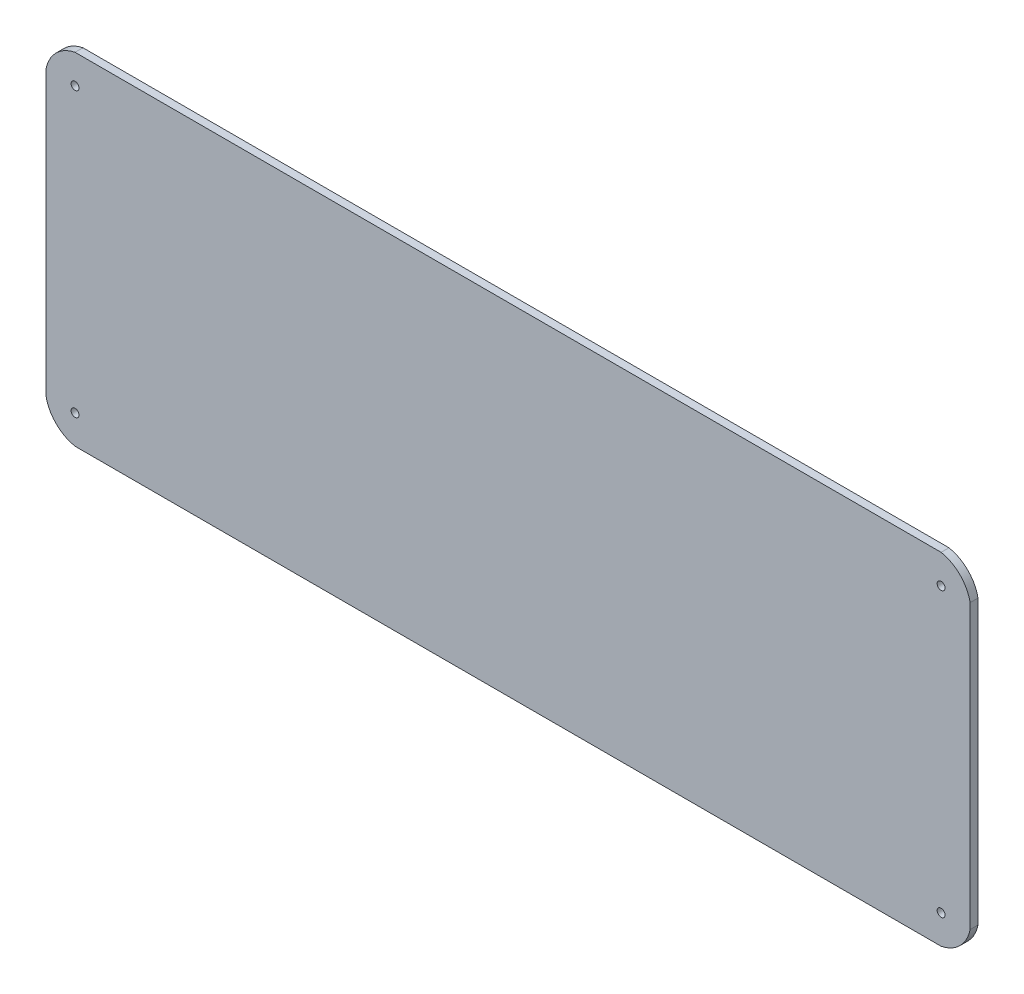
ISO-10303-21;
HEADER;
FILE_DESCRIPTION(('STEP AP214'),'2;1');
FILE_NAME('part.step','',(''),(''),'','','');
FILE_SCHEMA(('AUTOMOTIVE_DESIGN { 1 0 10303 214 1 1 1 1 }'));
ENDSEC;
DATA;
#1=APPLICATION_CONTEXT('core data for automotive mechanical design processes');
#2=APPLICATION_PROTOCOL_DEFINITION('international standard','automotive_design',2000,#1);
#3=PRODUCT_CONTEXT('',#1,'mechanical');
#4=PRODUCT('Part','Part','',(#3));
#5=PRODUCT_RELATED_PRODUCT_CATEGORY('part','',(#4));
#6=PRODUCT_DEFINITION_FORMATION('','',#4);
#7=PRODUCT_DEFINITION_CONTEXT('part definition',#1,'design');
#8=PRODUCT_DEFINITION('design','',#6,#7);
#9=PRODUCT_DEFINITION_SHAPE('','',#8);
#10=(LENGTH_UNIT() NAMED_UNIT(*) SI_UNIT(.MILLI.,.METRE.));
#11=(NAMED_UNIT(*) PLANE_ANGLE_UNIT() SI_UNIT($,.RADIAN.));
#12=(NAMED_UNIT(*) SI_UNIT($,.STERADIAN.) SOLID_ANGLE_UNIT());
#13=UNCERTAINTY_MEASURE_WITH_UNIT(LENGTH_MEASURE(1.E-05),#10,'distance_accuracy_value','');
#14=(GEOMETRIC_REPRESENTATION_CONTEXT(3) GLOBAL_UNCERTAINTY_ASSIGNED_CONTEXT((#13)) GLOBAL_UNIT_ASSIGNED_CONTEXT((#10,
#11,#12)) REPRESENTATION_CONTEXT('',''));
#15=CARTESIAN_POINT('',(0.,0.,0.));
#16=DIRECTION('',(0.,0.,1.));
#17=DIRECTION('',(1.,0.,0.));
#18=AXIS2_PLACEMENT_3D('',#15,#16,#17);
#19=CARTESIAN_POINT('',(-161.889002137033,51.0719371566333,3.));
#20=DIRECTION('',(0.,0.,1.));
#21=DIRECTION('',(1.,0.,0.));
#22=AXIS2_PLACEMENT_3D('',#19,#20,#21);
#23=PLANE('',#22);
#24=CARTESIAN_POINT('',(165.4303969933,-54.1267148028,3.));
#25=DIRECTION('',(0.,0.,1.));
#26=DIRECTION('',(1.,0.,0.));
#27=AXIS2_PLACEMENT_3D('',#24,#25,#26);
#28=CIRCLE('',#27,1.5);
#29=CARTESIAN_POINT('',(166.9303969933,-54.1267148028,3.));
#30=VERTEX_POINT('',#29);
#31=EDGE_CURVE('E188',#30,#30,#28,.T.);
#32=ORIENTED_EDGE('',*,*,#31,.F.);
#33=EDGE_LOOP('',(#32));
#34=FACE_BOUND('',#33,.T.);
#35=CARTESIAN_POINT('',(-164.5696030067,53.7525380263,3.));
#36=DIRECTION('',(0.,0.,1.));
#37=DIRECTION('',(1.,0.,0.));
#38=AXIS2_PLACEMENT_3D('',#35,#36,#37);
#39=CIRCLE('',#38,1.5);
#40=CARTESIAN_POINT('',(-163.0696030067,53.7525380263,3.));
#41=VERTEX_POINT('',#40);
#42=EDGE_CURVE('E134',#41,#41,#39,.T.);
#43=ORIENTED_EDGE('',*,*,#42,.F.);
#44=EDGE_LOOP('',(#43));
#45=FACE_BOUND('',#44,.T.);
#46=CARTESIAN_POINT('',(-161.889002137033,51.0719371566333,3.));
#47=DIRECTION('',(0.,0.,1.));
#48=DIRECTION('',(1.,0.,0.));
#49=AXIS2_PLACEMENT_3D('',#46,#47,#48);
#50=CIRCLE('',#49,14.);
#51=CARTESIAN_POINT('',(-164.5696030067,64.8129116118,3.));
#52=VERTEX_POINT('',#51);
#53=CARTESIAN_POINT('',(-175.6299765922,53.7525380263,3.));
#54=VERTEX_POINT('',#53);
#55=EDGE_CURVE('E145',#52,#54,#50,.T.);
#56=ORIENTED_EDGE('',*,*,#55,.T.);
#57=DIRECTION('',(0.,-1.,0.));
#58=VECTOR('',#57,1.);
#59=CARTESIAN_POINT('',(-175.6299765922,53.7525380263,3.));
#60=LINE('',#59,#58);
#61=CARTESIAN_POINT('',(-175.6299765922,-54.1267148028,3.));
#62=VERTEX_POINT('',#61);
#63=EDGE_CURVE('E93',#54,#62,#60,.T.);
#64=ORIENTED_EDGE('',*,*,#63,.T.);
#65=CARTESIAN_POINT('',(-161.889002137054,-51.4461139330294,3.));
#66=DIRECTION('',(0.,0.,1.));
#67=DIRECTION('',(1.,0.,0.));
#68=AXIS2_PLACEMENT_3D('',#65,#66,#67);
#69=CIRCLE('',#68,14.);
#70=CARTESIAN_POINT('',(-164.5696030067,-65.1870883882,3.));
#71=VERTEX_POINT('',#70);
#72=EDGE_CURVE('E160',#62,#71,#69,.T.);
#73=ORIENTED_EDGE('',*,*,#72,.T.);
#74=DIRECTION('',(1.,0.,0.));
#75=VECTOR('',#74,1.);
#76=CARTESIAN_POINT('',(165.4303969933,-65.1870883882,3.));
#77=LINE('',#76,#75);
#78=CARTESIAN_POINT('',(165.4303969933,-65.1870883882,3.));
#79=VERTEX_POINT('',#78);
#80=EDGE_CURVE('E173',#71,#79,#77,.T.);
#81=ORIENTED_EDGE('',*,*,#80,.T.);
#82=CARTESIAN_POINT('',(162.74979612355,-51.4461139330495,3.));
#83=DIRECTION('',(0.,0.,1.));
#84=DIRECTION('',(1.,0.,0.));
#85=AXIS2_PLACEMENT_3D('',#82,#83,#84);
#86=CIRCLE('',#85,14.0000000000002);
#87=CARTESIAN_POINT('',(176.4907705787,-54.1267148028,3.));
#88=VERTEX_POINT('',#87);
#89=EDGE_CURVE('E112',#79,#88,#86,.T.);
#90=ORIENTED_EDGE('',*,*,#89,.T.);
#91=DIRECTION('',(0.,1.,0.));
#92=VECTOR('',#91,1.);
#93=CARTESIAN_POINT('',(176.4907705787,53.7525380263,3.));
#94=LINE('',#93,#92);
#95=CARTESIAN_POINT('',(176.4907705787,53.7525380263,3.));
#96=VERTEX_POINT('',#95);
#97=EDGE_CURVE('E106',#88,#96,#94,.T.);
#98=ORIENTED_EDGE('',*,*,#97,.T.);
#99=CARTESIAN_POINT('',(162.749796123529,51.0719371566536,3.));
#100=DIRECTION('',(0.,0.,1.));
#101=DIRECTION('',(1.,0.,0.));
#102=AXIS2_PLACEMENT_3D('',#99,#100,#101);
#103=CIRCLE('',#102,14.);
#104=CARTESIAN_POINT('',(165.4303969933,64.8129116118,3.));
#105=VERTEX_POINT('',#104);
#106=EDGE_CURVE('E110',#96,#105,#103,.T.);
#107=ORIENTED_EDGE('',*,*,#106,.T.);
#108=DIRECTION('',(-1.,0.,0.));
#109=VECTOR('',#108,1.);
#110=CARTESIAN_POINT('',(-164.5696030067,64.8129116118,3.));
#111=LINE('',#110,#109);
#112=EDGE_CURVE('E50',#105,#52,#111,.T.);
#113=ORIENTED_EDGE('',*,*,#112,.T.);
#114=EDGE_LOOP('',(#56,#64,#73,#81,#90,#98,#107,#113));
#115=FACE_BOUND('',#114,.T.);
#116=CARTESIAN_POINT('',(-164.5696030067,-54.1542414293,3.));
#117=DIRECTION('',(0.,0.,1.));
#118=DIRECTION('',(1.,0.,0.));
#119=AXIS2_PLACEMENT_3D('',#116,#117,#118);
#120=CIRCLE('',#119,1.5);
#121=CARTESIAN_POINT('',(-163.0696030067,-54.1542414293,3.));
#122=VERTEX_POINT('',#121);
#123=EDGE_CURVE('E182',#122,#122,#120,.T.);
#124=ORIENTED_EDGE('',*,*,#123,.F.);
#125=EDGE_LOOP('',(#124));
#126=FACE_BOUND('',#125,.T.);
#127=CARTESIAN_POINT('',(165.4303969933,53.7525380263,3.));
#128=DIRECTION('',(0.,0.,1.));
#129=DIRECTION('',(1.,0.,0.));
#130=AXIS2_PLACEMENT_3D('',#127,#128,#129);
#131=CIRCLE('',#130,1.5);
#132=CARTESIAN_POINT('',(166.9303969933,53.7525380263,3.));
#133=VERTEX_POINT('',#132);
#134=EDGE_CURVE('E194',#133,#133,#131,.T.);
#135=ORIENTED_EDGE('',*,*,#134,.F.);
#136=EDGE_LOOP('',(#135));
#137=FACE_BOUND('',#136,.T.);
#138=ADVANCED_FACE('F33',(#34,#45,#115,#126,#137),#23,.T.);
#139=CARTESIAN_POINT('',(-161.889002137033,51.0719371566333,0.));
#140=DIRECTION('',(0.,0.,1.));
#141=DIRECTION('',(1.,0.,0.));
#142=AXIS2_PLACEMENT_3D('',#139,#140,#141);
#143=PLANE('',#142);
#144=CARTESIAN_POINT('',(-161.889002137033,51.0719371566333,0.));
#145=DIRECTION('',(0.,0.,1.));
#146=DIRECTION('',(1.,0.,0.));
#147=AXIS2_PLACEMENT_3D('',#144,#145,#146);
#148=CIRCLE('',#147,14.);
#149=CARTESIAN_POINT('',(-164.5696030067,64.8129116118,0.));
#150=VERTEX_POINT('',#149);
#151=CARTESIAN_POINT('',(-175.6299765922,53.7525380263,0.));
#152=VERTEX_POINT('',#151);
#153=EDGE_CURVE('E130',#150,#152,#148,.T.);
#154=ORIENTED_EDGE('',*,*,#153,.F.);
#155=DIRECTION('',(-1.,0.,0.));
#156=VECTOR('',#155,1.);
#157=CARTESIAN_POINT('',(-164.5696030067,64.8129116118,0.));
#158=LINE('',#157,#156);
#159=CARTESIAN_POINT('',(165.4303969933,64.8129116118,0.));
#160=VERTEX_POINT('',#159);
#161=EDGE_CURVE('E85',#160,#150,#158,.T.);
#162=ORIENTED_EDGE('',*,*,#161,.F.);
#163=CARTESIAN_POINT('',(162.749796123529,51.0719371566536,0.));
#164=DIRECTION('',(0.,0.,1.));
#165=DIRECTION('',(1.,0.,0.));
#166=AXIS2_PLACEMENT_3D('',#163,#164,#165);
#167=CIRCLE('',#166,14.);
#168=CARTESIAN_POINT('',(176.4907705787,53.7525380263,0.));
#169=VERTEX_POINT('',#168);
#170=EDGE_CURVE('E79',#169,#160,#167,.T.);
#171=ORIENTED_EDGE('',*,*,#170,.F.);
#172=DIRECTION('',(0.,1.,0.));
#173=VECTOR('',#172,1.);
#174=CARTESIAN_POINT('',(176.4907705787,53.7525380263,0.));
#175=LINE('',#174,#173);
#176=CARTESIAN_POINT('',(176.4907705787,-54.1267148028,0.));
#177=VERTEX_POINT('',#176);
#178=EDGE_CURVE('E120',#177,#169,#175,.T.);
#179=ORIENTED_EDGE('',*,*,#178,.F.);
#180=CARTESIAN_POINT('',(162.74979612355,-51.4461139330495,0.));
#181=DIRECTION('',(0.,0.,1.));
#182=DIRECTION('',(1.,0.,0.));
#183=AXIS2_PLACEMENT_3D('',#180,#181,#182);
#184=CIRCLE('',#183,14.0000000000002);
#185=CARTESIAN_POINT('',(165.4303969933,-65.1870883882,0.));
#186=VERTEX_POINT('',#185);
#187=EDGE_CURVE('E140',#186,#177,#184,.T.);
#188=ORIENTED_EDGE('',*,*,#187,.F.);
#189=DIRECTION('',(1.,0.,0.));
#190=VECTOR('',#189,1.);
#191=CARTESIAN_POINT('',(165.4303969933,-65.1870883882,0.));
#192=LINE('',#191,#190);
#193=CARTESIAN_POINT('',(-164.5696030067,-65.1870883882,0.));
#194=VERTEX_POINT('',#193);
#195=EDGE_CURVE('E138',#194,#186,#192,.T.);
#196=ORIENTED_EDGE('',*,*,#195,.F.);
#197=CARTESIAN_POINT('',(-161.889002137054,-51.4461139330294,0.));
#198=DIRECTION('',(0.,0.,1.));
#199=DIRECTION('',(1.,0.,0.));
#200=AXIS2_PLACEMENT_3D('',#197,#198,#199);
#201=CIRCLE('',#200,14.);
#202=CARTESIAN_POINT('',(-175.6299765922,-54.1267148028,0.));
#203=VERTEX_POINT('',#202);
#204=EDGE_CURVE('E136',#203,#194,#201,.T.);
#205=ORIENTED_EDGE('',*,*,#204,.F.);
#206=DIRECTION('',(0.,-1.,0.));
#207=VECTOR('',#206,1.);
#208=CARTESIAN_POINT('',(-175.6299765922,53.7525380263,0.));
#209=LINE('',#208,#207);
#210=EDGE_CURVE('E133',#152,#203,#209,.T.);
#211=ORIENTED_EDGE('',*,*,#210,.F.);
#212=EDGE_LOOP('',(#154,#162,#171,#179,#188,#196,#205,#211));
#213=FACE_BOUND('',#212,.T.);
#214=CARTESIAN_POINT('',(-164.5696030067,53.7525380263,0.));
#215=DIRECTION('',(0.,0.,1.));
#216=DIRECTION('',(1.,0.,0.));
#217=AXIS2_PLACEMENT_3D('',#214,#215,#216);
#218=CIRCLE('',#217,1.5);
#219=CARTESIAN_POINT('',(-163.0696030067,53.7525380263,0.));
#220=VERTEX_POINT('',#219);
#221=EDGE_CURVE('E179',#220,#220,#218,.T.);
#222=ORIENTED_EDGE('',*,*,#221,.T.);
#223=EDGE_LOOP('',(#222));
#224=FACE_BOUND('',#223,.T.);
#225=CARTESIAN_POINT('',(-164.5696030067,-54.1542414293,0.));
#226=DIRECTION('',(0.,0.,1.));
#227=DIRECTION('',(1.,0.,0.));
#228=AXIS2_PLACEMENT_3D('',#225,#226,#227);
#229=CIRCLE('',#228,1.5);
#230=CARTESIAN_POINT('',(-163.0696030067,-54.1542414293,0.));
#231=VERTEX_POINT('',#230);
#232=EDGE_CURVE('E185',#231,#231,#229,.T.);
#233=ORIENTED_EDGE('',*,*,#232,.T.);
#234=EDGE_LOOP('',(#233));
#235=FACE_BOUND('',#234,.T.);
#236=CARTESIAN_POINT('',(165.4303969933,-54.1267148028,0.));
#237=DIRECTION('',(0.,0.,1.));
#238=DIRECTION('',(1.,0.,0.));
#239=AXIS2_PLACEMENT_3D('',#236,#237,#238);
#240=CIRCLE('',#239,1.5);
#241=CARTESIAN_POINT('',(166.9303969933,-54.1267148028,0.));
#242=VERTEX_POINT('',#241);
#243=EDGE_CURVE('E191',#242,#242,#240,.T.);
#244=ORIENTED_EDGE('',*,*,#243,.T.);
#245=EDGE_LOOP('',(#244));
#246=FACE_BOUND('',#245,.T.);
#247=CARTESIAN_POINT('',(165.4303969933,53.7525380263,0.));
#248=DIRECTION('',(0.,0.,1.));
#249=DIRECTION('',(1.,0.,0.));
#250=AXIS2_PLACEMENT_3D('',#247,#248,#249);
#251=CIRCLE('',#250,1.5);
#252=CARTESIAN_POINT('',(166.9303969933,53.7525380263,0.));
#253=VERTEX_POINT('',#252);
#254=EDGE_CURVE('E197',#253,#253,#251,.T.);
#255=ORIENTED_EDGE('',*,*,#254,.T.);
#256=EDGE_LOOP('',(#255));
#257=FACE_BOUND('',#256,.T.);
#258=ADVANCED_FACE('F164',(#213,#224,#235,#246,#257),#143,.F.);
#259=CARTESIAN_POINT('',(-161.889002137033,51.0719371566333,3.));
#260=DIRECTION('',(0.,0.,-1.));
#261=DIRECTION('',(-1.,0.,0.));
#262=AXIS2_PLACEMENT_3D('',#259,#260,#261);
#263=CYLINDRICAL_SURFACE('',#262,14.);
#264=ORIENTED_EDGE('',*,*,#153,.T.);
#265=DIRECTION('',(0.,0.,-1.));
#266=VECTOR('',#265,1.);
#267=CARTESIAN_POINT('',(-175.6299765922,53.7525380263,3.));
#268=LINE('',#267,#266);
#269=EDGE_CURVE('E11',#54,#152,#268,.T.);
#270=ORIENTED_EDGE('',*,*,#269,.F.);
#271=ORIENTED_EDGE('',*,*,#55,.F.);
#272=DIRECTION('',(0.,0.,-1.));
#273=VECTOR('',#272,1.);
#274=CARTESIAN_POINT('',(-164.5696030067,64.8129116118,3.));
#275=LINE('',#274,#273);
#276=EDGE_CURVE('E126',#52,#150,#275,.T.);
#277=ORIENTED_EDGE('',*,*,#276,.T.);
#278=EDGE_LOOP('',(#264,#270,#271,#277));
#279=FACE_BOUND('',#278,.T.);
#280=ADVANCED_FACE('F35',(#279),#263,.T.);
#281=CARTESIAN_POINT('',(-175.6299765922,53.7525380263,3.));
#282=DIRECTION('',(1.,0.,0.));
#283=DIRECTION('',(0.,0.,-1.));
#284=AXIS2_PLACEMENT_3D('',#281,#282,#283);
#285=PLANE('',#284);
#286=ORIENTED_EDGE('',*,*,#210,.T.);
#287=DIRECTION('',(0.,0.,-1.));
#288=VECTOR('',#287,1.);
#289=CARTESIAN_POINT('',(-175.6299765922,-54.1267148028,3.));
#290=LINE('',#289,#288);
#291=EDGE_CURVE('E42',#62,#203,#290,.T.);
#292=ORIENTED_EDGE('',*,*,#291,.F.);
#293=ORIENTED_EDGE('',*,*,#63,.F.);
#294=ORIENTED_EDGE('',*,*,#269,.T.);
#295=EDGE_LOOP('',(#286,#292,#293,#294));
#296=FACE_BOUND('',#295,.T.);
#297=ADVANCED_FACE('F231',(#296),#285,.F.);
#298=CARTESIAN_POINT('',(-161.889002137054,-51.4461139330294,3.));
#299=DIRECTION('',(0.,0.,-1.));
#300=DIRECTION('',(-1.,0.,0.));
#301=AXIS2_PLACEMENT_3D('',#298,#299,#300);
#302=CYLINDRICAL_SURFACE('',#301,14.);
#303=ORIENTED_EDGE('',*,*,#204,.T.);
#304=DIRECTION('',(0.,0.,-1.));
#305=VECTOR('',#304,1.);
#306=CARTESIAN_POINT('',(-164.5696030067,-65.1870883882,3.));
#307=LINE('',#306,#305);
#308=EDGE_CURVE('E152',#71,#194,#307,.T.);
#309=ORIENTED_EDGE('',*,*,#308,.F.);
#310=ORIENTED_EDGE('',*,*,#72,.F.);
#311=ORIENTED_EDGE('',*,*,#291,.T.);
#312=EDGE_LOOP('',(#303,#309,#310,#311));
#313=FACE_BOUND('',#312,.T.);
#314=ADVANCED_FACE('F158',(#313),#302,.T.);
#315=CARTESIAN_POINT('',(165.4303969933,-65.1870883882,3.));
#316=DIRECTION('',(0.,1.,0.));
#317=DIRECTION('',(0.,0.,1.));
#318=AXIS2_PLACEMENT_3D('',#315,#316,#317);
#319=PLANE('',#318);
#320=ORIENTED_EDGE('',*,*,#195,.T.);
#321=DIRECTION('',(0.,0.,-1.));
#322=VECTOR('',#321,1.);
#323=CARTESIAN_POINT('',(165.4303969933,-65.1870883882,3.));
#324=LINE('',#323,#322);
#325=EDGE_CURVE('E149',#79,#186,#324,.T.);
#326=ORIENTED_EDGE('',*,*,#325,.F.);
#327=ORIENTED_EDGE('',*,*,#80,.F.);
#328=ORIENTED_EDGE('',*,*,#308,.T.);
#329=EDGE_LOOP('',(#320,#326,#327,#328));
#330=FACE_BOUND('',#329,.T.);
#331=ADVANCED_FACE('F169',(#330),#319,.F.);
#332=CARTESIAN_POINT('',(162.74979612355,-51.4461139330495,3.));
#333=DIRECTION('',(0.,0.,-1.));
#334=DIRECTION('',(-1.,0.,0.));
#335=AXIS2_PLACEMENT_3D('',#332,#333,#334);
#336=CYLINDRICAL_SURFACE('',#335,14.0000000000002);
#337=ORIENTED_EDGE('',*,*,#187,.T.);
#338=DIRECTION('',(0.,0.,-1.));
#339=VECTOR('',#338,1.);
#340=CARTESIAN_POINT('',(176.4907705787,-54.1267148028,3.));
#341=LINE('',#340,#339);
#342=EDGE_CURVE('E121',#88,#177,#341,.T.);
#343=ORIENTED_EDGE('',*,*,#342,.F.);
#344=ORIENTED_EDGE('',*,*,#89,.F.);
#345=ORIENTED_EDGE('',*,*,#325,.T.);
#346=EDGE_LOOP('',(#337,#343,#344,#345));
#347=FACE_BOUND('',#346,.T.);
#348=ADVANCED_FACE('F172',(#347),#336,.T.);
#349=CARTESIAN_POINT('',(176.4907705787,53.7525380263,3.));
#350=DIRECTION('',(-1.,0.,0.));
#351=DIRECTION('',(0.,0.,1.));
#352=AXIS2_PLACEMENT_3D('',#349,#350,#351);
#353=PLANE('',#352);
#354=ORIENTED_EDGE('',*,*,#178,.T.);
#355=DIRECTION('',(0.,0.,-1.));
#356=VECTOR('',#355,1.);
#357=CARTESIAN_POINT('',(176.4907705787,53.7525380263,3.));
#358=LINE('',#357,#356);
#359=EDGE_CURVE('E117',#96,#169,#358,.T.);
#360=ORIENTED_EDGE('',*,*,#359,.F.);
#361=ORIENTED_EDGE('',*,*,#97,.F.);
#362=ORIENTED_EDGE('',*,*,#342,.T.);
#363=EDGE_LOOP('',(#354,#360,#361,#362));
#364=FACE_BOUND('',#363,.T.);
#365=ADVANCED_FACE('F118',(#364),#353,.F.);
#366=CARTESIAN_POINT('',(162.749796123529,51.0719371566536,3.));
#367=DIRECTION('',(0.,0.,-1.));
#368=DIRECTION('',(-1.,0.,0.));
#369=AXIS2_PLACEMENT_3D('',#366,#367,#368);
#370=CYLINDRICAL_SURFACE('',#369,14.);
#371=ORIENTED_EDGE('',*,*,#170,.T.);
#372=DIRECTION('',(0.,0.,-1.));
#373=VECTOR('',#372,1.);
#374=CARTESIAN_POINT('',(165.4303969933,64.8129116118,3.));
#375=LINE('',#374,#373);
#376=EDGE_CURVE('E122',#105,#160,#375,.T.);
#377=ORIENTED_EDGE('',*,*,#376,.F.);
#378=ORIENTED_EDGE('',*,*,#106,.F.);
#379=ORIENTED_EDGE('',*,*,#359,.T.);
#380=EDGE_LOOP('',(#371,#377,#378,#379));
#381=FACE_BOUND('',#380,.T.);
#382=ADVANCED_FACE('F124',(#381),#370,.T.);
#383=CARTESIAN_POINT('',(-164.5696030067,64.8129116118,3.));
#384=DIRECTION('',(0.,-1.,0.));
#385=DIRECTION('',(0.,0.,-1.));
#386=AXIS2_PLACEMENT_3D('',#383,#384,#385);
#387=PLANE('',#386);
#388=ORIENTED_EDGE('',*,*,#161,.T.);
#389=ORIENTED_EDGE('',*,*,#276,.F.);
#390=ORIENTED_EDGE('',*,*,#112,.F.);
#391=ORIENTED_EDGE('',*,*,#376,.T.);
#392=EDGE_LOOP('',(#388,#389,#390,#391));
#393=FACE_BOUND('',#392,.T.);
#394=ADVANCED_FACE('F219',(#393),#387,.F.);
#395=CARTESIAN_POINT('',(-164.5696030067,53.7525380263,3.));
#396=DIRECTION('',(0.,0.,-1.));
#397=DIRECTION('',(-1.,0.,0.));
#398=AXIS2_PLACEMENT_3D('',#395,#396,#397);
#399=CYLINDRICAL_SURFACE('',#398,1.5);
#400=ORIENTED_EDGE('',*,*,#42,.T.);
#401=EDGE_LOOP('',(#400));
#402=FACE_BOUND('',#401,.T.);
#403=ORIENTED_EDGE('',*,*,#221,.F.);
#404=EDGE_LOOP('',(#403));
#405=FACE_BOUND('',#404,.T.);
#406=ADVANCED_FACE('F216',(#402,#405),#399,.F.);
#407=CARTESIAN_POINT('',(-164.5696030067,-54.1542414293,3.));
#408=DIRECTION('',(0.,0.,-1.));
#409=DIRECTION('',(-1.,0.,0.));
#410=AXIS2_PLACEMENT_3D('',#407,#408,#409);
#411=CYLINDRICAL_SURFACE('',#410,1.5);
#412=ORIENTED_EDGE('',*,*,#123,.T.);
#413=EDGE_LOOP('',(#412));
#414=FACE_BOUND('',#413,.T.);
#415=ORIENTED_EDGE('',*,*,#232,.F.);
#416=EDGE_LOOP('',(#415));
#417=FACE_BOUND('',#416,.T.);
#418=ADVANCED_FACE('F295',(#414,#417),#411,.F.);
#419=CARTESIAN_POINT('',(165.4303969933,-54.1267148028,3.));
#420=DIRECTION('',(0.,0.,-1.));
#421=DIRECTION('',(-1.,0.,0.));
#422=AXIS2_PLACEMENT_3D('',#419,#420,#421);
#423=CYLINDRICAL_SURFACE('',#422,1.5);
#424=ORIENTED_EDGE('',*,*,#31,.T.);
#425=EDGE_LOOP('',(#424));
#426=FACE_BOUND('',#425,.T.);
#427=ORIENTED_EDGE('',*,*,#243,.F.);
#428=EDGE_LOOP('',(#427));
#429=FACE_BOUND('',#428,.T.);
#430=ADVANCED_FACE('F303',(#426,#429),#423,.F.);
#431=CARTESIAN_POINT('',(165.4303969933,53.7525380263,3.));
#432=DIRECTION('',(0.,0.,-1.));
#433=DIRECTION('',(-1.,0.,0.));
#434=AXIS2_PLACEMENT_3D('',#431,#432,#433);
#435=CYLINDRICAL_SURFACE('',#434,1.5);
#436=ORIENTED_EDGE('',*,*,#134,.T.);
#437=EDGE_LOOP('',(#436));
#438=FACE_BOUND('',#437,.T.);
#439=ORIENTED_EDGE('',*,*,#254,.F.);
#440=EDGE_LOOP('',(#439));
#441=FACE_BOUND('',#440,.T.);
#442=ADVANCED_FACE('F203',(#438,#441),#435,.F.);
#443=CLOSED_SHELL('',(#138,#258,#280,#297,#314,#331,#348,#365,#382,#394,#406,#418,#430,#442));
#444=MANIFOLD_SOLID_BREP('B2',#443);
#445=ADVANCED_BREP_SHAPE_REPRESENTATION('',(#18,#444),#14);
#446=SHAPE_DEFINITION_REPRESENTATION(#9,#445);
ENDSEC;
END-ISO-10303-21;
